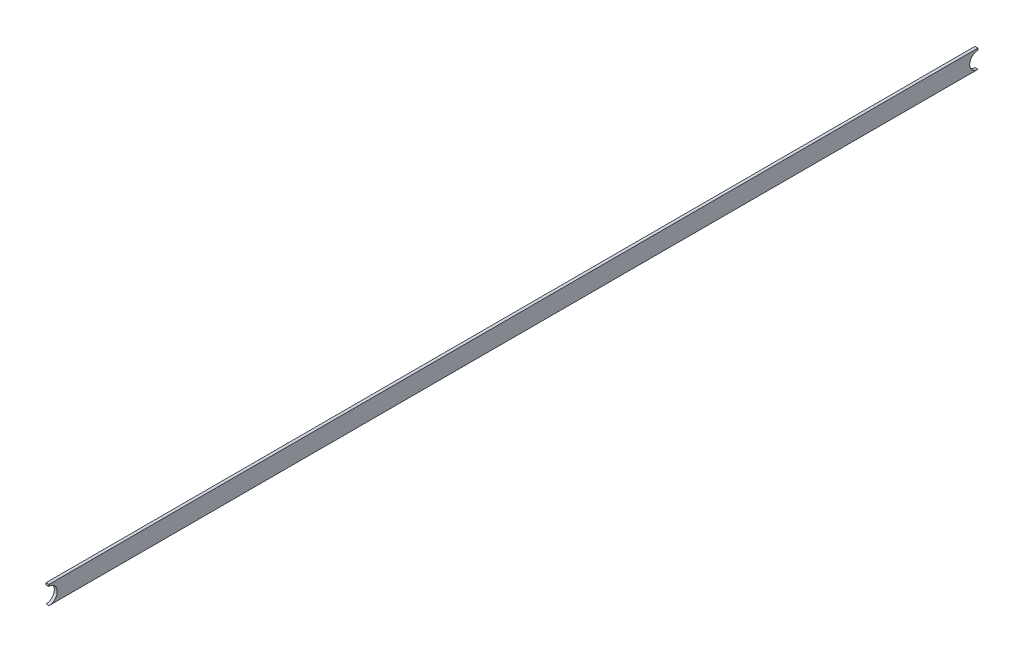
ISO-10303-21;
HEADER;
FILE_DESCRIPTION(('STEP AP214'),'2;1');
FILE_NAME('part.step','',(''),(''),'','','');
FILE_SCHEMA(('AUTOMOTIVE_DESIGN { 1 0 10303 214 1 1 1 1 }'));
ENDSEC;
DATA;
#1=APPLICATION_CONTEXT('core data for automotive mechanical design processes');
#2=APPLICATION_PROTOCOL_DEFINITION('international standard','automotive_design',2000,#1);
#3=PRODUCT_CONTEXT('',#1,'mechanical');
#4=PRODUCT('Part','Part','',(#3));
#5=PRODUCT_RELATED_PRODUCT_CATEGORY('part','',(#4));
#6=PRODUCT_DEFINITION_FORMATION('','',#4);
#7=PRODUCT_DEFINITION_CONTEXT('part definition',#1,'design');
#8=PRODUCT_DEFINITION('design','',#6,#7);
#9=PRODUCT_DEFINITION_SHAPE('','',#8);
#10=(LENGTH_UNIT() NAMED_UNIT(*) SI_UNIT(.MILLI.,.METRE.));
#11=(NAMED_UNIT(*) PLANE_ANGLE_UNIT() SI_UNIT($,.RADIAN.));
#12=(NAMED_UNIT(*) SI_UNIT($,.STERADIAN.) SOLID_ANGLE_UNIT());
#13=UNCERTAINTY_MEASURE_WITH_UNIT(LENGTH_MEASURE(1.E-05),#10,'distance_accuracy_value','');
#14=(GEOMETRIC_REPRESENTATION_CONTEXT(3) GLOBAL_UNCERTAINTY_ASSIGNED_CONTEXT((#13)) GLOBAL_UNIT_ASSIGNED_CONTEXT((#10,
#11,#12)) REPRESENTATION_CONTEXT('',''));
#15=CARTESIAN_POINT('',(0.,0.,0.));
#16=DIRECTION('',(0.,0.,1.));
#17=DIRECTION('',(1.,0.,0.));
#18=AXIS2_PLACEMENT_3D('',#15,#16,#17);
#19=CARTESIAN_POINT('',(-4.,25.,1237.5));
#20=DIRECTION('',(1.,0.,0.));
#21=DIRECTION('',(0.,0.,-1.));
#22=AXIS2_PLACEMENT_3D('',#19,#20,#21);
#23=PLANE('',#22);
#24=DIRECTION('',(0.,0.,-1.));
#25=VECTOR('',#24,1.);
#26=CARTESIAN_POINT('',(-4.,25.,1237.5));
#27=LINE('',#26,#25);
#28=CARTESIAN_POINT('',(-4.,25.,1260.));
#29=VERTEX_POINT('',#28);
#30=CARTESIAN_POINT('',(-4.,25.,-1260.));
#31=VERTEX_POINT('',#30);
#32=EDGE_CURVE('E93',#29,#31,#27,.T.);
#33=ORIENTED_EDGE('',*,*,#32,.T.);
#34=DIRECTION('',(0.,1.,0.));
#35=VECTOR('',#34,1.);
#36=CARTESIAN_POINT('',(-4.,0.,-1260.));
#37=LINE('',#36,#35);
#38=CARTESIAN_POINT('',(-4.,19.9999999999999,-1260.));
#39=VERTEX_POINT('',#38);
#40=EDGE_CURVE('E140',#39,#31,#37,.T.);
#41=ORIENTED_EDGE('',*,*,#40,.F.);
#42=CARTESIAN_POINT('',(-4.,-2.5,-1260.));
#43=DIRECTION('',(1.,0.,0.));
#44=DIRECTION('',(0.,0.,-1.));
#45=AXIS2_PLACEMENT_3D('',#42,#43,#44);
#46=CIRCLE('',#45,22.4999999999999);
#47=CARTESIAN_POINT('',(-4.,-25.,-1260.));
#48=VERTEX_POINT('',#47);
#49=EDGE_CURVE('E138',#39,#48,#46,.T.);
#50=ORIENTED_EDGE('',*,*,#49,.T.);
#51=DIRECTION('',(0.,0.,-1.));
#52=VECTOR('',#51,1.);
#53=CARTESIAN_POINT('',(-4.,-25.,1237.5));
#54=LINE('',#53,#52);
#55=CARTESIAN_POINT('',(-4.,-25.,1260.));
#56=VERTEX_POINT('',#55);
#57=EDGE_CURVE('E12',#56,#48,#54,.T.);
#58=ORIENTED_EDGE('',*,*,#57,.F.);
#59=CARTESIAN_POINT('',(-4.,-2.5,1260.));
#60=DIRECTION('',(1.,0.,0.));
#61=DIRECTION('',(0.,0.,-1.));
#62=AXIS2_PLACEMENT_3D('',#59,#60,#61);
#63=CIRCLE('',#62,22.4999999999999);
#64=CARTESIAN_POINT('',(-4.,19.9999999999999,1260.));
#65=VERTEX_POINT('',#64);
#66=EDGE_CURVE('E100',#65,#56,#63,.F.);
#67=ORIENTED_EDGE('',*,*,#66,.F.);
#68=DIRECTION('',(0.,1.,0.));
#69=VECTOR('',#68,1.);
#70=CARTESIAN_POINT('',(-4.,0.,1260.));
#71=LINE('',#70,#69);
#72=EDGE_CURVE('E162',#65,#29,#71,.T.);
#73=ORIENTED_EDGE('',*,*,#72,.T.);
#74=EDGE_LOOP('',(#33,#41,#50,#58,#67,#73));
#75=FACE_BOUND('',#74,.T.);
#76=ADVANCED_FACE('F79',(#75),#23,.F.);
#77=CARTESIAN_POINT('',(-4.,-25.,1237.5));
#78=DIRECTION('',(0.,1.,0.));
#79=DIRECTION('',(0.,0.,1.));
#80=AXIS2_PLACEMENT_3D('',#77,#78,#79);
#81=PLANE('',#80);
#82=ORIENTED_EDGE('',*,*,#57,.T.);
#83=DIRECTION('',(1.,0.,0.));
#84=VECTOR('',#83,1.);
#85=CARTESIAN_POINT('',(-39.5316760088797,-25.,-1260.));
#86=LINE('',#85,#84);
#87=CARTESIAN_POINT('',(4.,-25.,-1260.));
#88=VERTEX_POINT('',#87);
#89=EDGE_CURVE('E134',#48,#88,#86,.T.);
#90=ORIENTED_EDGE('',*,*,#89,.T.);
#91=DIRECTION('',(0.,0.,-1.));
#92=VECTOR('',#91,1.);
#93=CARTESIAN_POINT('',(4.,-25.,1237.5));
#94=LINE('',#93,#92);
#95=CARTESIAN_POINT('',(4.,-25.,1260.));
#96=VERTEX_POINT('',#95);
#97=EDGE_CURVE('E86',#96,#88,#94,.T.);
#98=ORIENTED_EDGE('',*,*,#97,.F.);
#99=DIRECTION('',(1.,0.,0.));
#100=VECTOR('',#99,1.);
#101=CARTESIAN_POINT('',(-39.5316760088797,-25.,1260.));
#102=LINE('',#101,#100);
#103=EDGE_CURVE('E136',#56,#96,#102,.T.);
#104=ORIENTED_EDGE('',*,*,#103,.F.);
#105=EDGE_LOOP('',(#82,#90,#98,#104));
#106=FACE_BOUND('',#105,.T.);
#107=ADVANCED_FACE('F132',(#106),#81,.F.);
#108=CARTESIAN_POINT('',(4.,25.,1237.5));
#109=DIRECTION('',(-1.,0.,0.));
#110=DIRECTION('',(0.,0.,1.));
#111=AXIS2_PLACEMENT_3D('',#108,#109,#110);
#112=PLANE('',#111);
#113=ORIENTED_EDGE('',*,*,#97,.T.);
#114=CARTESIAN_POINT('',(4.,-2.5,-1260.));
#115=DIRECTION('',(-1.,0.,0.));
#116=DIRECTION('',(0.,0.,1.));
#117=AXIS2_PLACEMENT_3D('',#114,#115,#116);
#118=CIRCLE('',#117,22.4999999999999);
#119=CARTESIAN_POINT('',(4.,19.9999999999999,-1260.));
#120=VERTEX_POINT('',#119);
#121=EDGE_CURVE('E147',#88,#120,#118,.T.);
#122=ORIENTED_EDGE('',*,*,#121,.T.);
#123=DIRECTION('',(0.,-1.,0.));
#124=VECTOR('',#123,1.);
#125=CARTESIAN_POINT('',(4.,0.,-1260.));
#126=LINE('',#125,#124);
#127=CARTESIAN_POINT('',(4.,25.,-1260.));
#128=VERTEX_POINT('',#127);
#129=EDGE_CURVE('E149',#128,#120,#126,.T.);
#130=ORIENTED_EDGE('',*,*,#129,.F.);
#131=DIRECTION('',(0.,0.,-1.));
#132=VECTOR('',#131,1.);
#133=CARTESIAN_POINT('',(4.,25.,1237.5));
#134=LINE('',#133,#132);
#135=CARTESIAN_POINT('',(4.,25.,1260.));
#136=VERTEX_POINT('',#135);
#137=EDGE_CURVE('E175',#136,#128,#134,.T.);
#138=ORIENTED_EDGE('',*,*,#137,.F.);
#139=DIRECTION('',(0.,-1.,0.));
#140=VECTOR('',#139,1.);
#141=CARTESIAN_POINT('',(4.,0.,1260.));
#142=LINE('',#141,#140);
#143=CARTESIAN_POINT('',(4.,19.9999999999999,1260.));
#144=VERTEX_POINT('',#143);
#145=EDGE_CURVE('E168',#136,#144,#142,.T.);
#146=ORIENTED_EDGE('',*,*,#145,.T.);
#147=CARTESIAN_POINT('',(4.,-2.5,1260.));
#148=DIRECTION('',(1.,0.,0.));
#149=DIRECTION('',(0.,0.,-1.));
#150=AXIS2_PLACEMENT_3D('',#147,#148,#149);
#151=CIRCLE('',#150,22.4999999999999);
#152=EDGE_CURVE('E161',#96,#144,#151,.T.);
#153=ORIENTED_EDGE('',*,*,#152,.F.);
#154=EDGE_LOOP('',(#113,#122,#130,#138,#146,#153));
#155=FACE_BOUND('',#154,.T.);
#156=ADVANCED_FACE('F178',(#155),#112,.F.);
#157=CARTESIAN_POINT('',(-4.,25.,1237.5));
#158=DIRECTION('',(0.,-1.,0.));
#159=DIRECTION('',(0.,0.,-1.));
#160=AXIS2_PLACEMENT_3D('',#157,#158,#159);
#161=PLANE('',#160);
#162=ORIENTED_EDGE('',*,*,#137,.T.);
#163=DIRECTION('',(1.,0.,0.));
#164=VECTOR('',#163,1.);
#165=CARTESIAN_POINT('',(-39.5316760088797,25.,-1260.));
#166=LINE('',#165,#164);
#167=EDGE_CURVE('E155',#31,#128,#166,.T.);
#168=ORIENTED_EDGE('',*,*,#167,.F.);
#169=ORIENTED_EDGE('',*,*,#32,.F.);
#170=DIRECTION('',(1.,0.,0.));
#171=VECTOR('',#170,1.);
#172=CARTESIAN_POINT('',(-39.5316760088797,25.,1260.));
#173=LINE('',#172,#171);
#174=EDGE_CURVE('E171',#29,#136,#173,.T.);
#175=ORIENTED_EDGE('',*,*,#174,.T.);
#176=EDGE_LOOP('',(#162,#168,#169,#175));
#177=FACE_BOUND('',#176,.T.);
#178=ADVANCED_FACE('F187',(#177),#161,.F.);
#179=CARTESIAN_POINT('',(-39.5316760088797,0.,1260.));
#180=DIRECTION('',(0.,0.,1.));
#181=DIRECTION('',(1.,0.,0.));
#182=AXIS2_PLACEMENT_3D('',#179,#180,#181);
#183=PLANE('',#182);
#184=ORIENTED_EDGE('',*,*,#72,.F.);
#185=DIRECTION('',(1.,0.,0.));
#186=VECTOR('',#185,1.);
#187=CARTESIAN_POINT('',(-39.5316760088797,19.9999999999999,1260.));
#188=LINE('',#187,#186);
#189=EDGE_CURVE('E164',#65,#144,#188,.T.);
#190=ORIENTED_EDGE('',*,*,#189,.T.);
#191=ORIENTED_EDGE('',*,*,#145,.F.);
#192=ORIENTED_EDGE('',*,*,#174,.F.);
#193=EDGE_LOOP('',(#184,#190,#191,#192));
#194=FACE_BOUND('',#193,.T.);
#195=ADVANCED_FACE('F186',(#194),#183,.T.);
#196=CARTESIAN_POINT('',(-39.5316760088797,-2.5,1260.));
#197=DIRECTION('',(1.,0.,0.));
#198=DIRECTION('',(0.,0.,-1.));
#199=AXIS2_PLACEMENT_3D('',#196,#197,#198);
#200=CYLINDRICAL_SURFACE('',#199,22.4999999999999);
#201=ORIENTED_EDGE('',*,*,#189,.F.);
#202=ORIENTED_EDGE('',*,*,#66,.T.);
#203=ORIENTED_EDGE('',*,*,#103,.T.);
#204=ORIENTED_EDGE('',*,*,#152,.T.);
#205=EDGE_LOOP('',(#201,#202,#203,#204));
#206=FACE_BOUND('',#205,.T.);
#207=ADVANCED_FACE('F182',(#206),#200,.F.);
#208=CARTESIAN_POINT('',(-39.5316760088797,0.,-1260.));
#209=DIRECTION('',(0.,0.,1.));
#210=DIRECTION('',(1.,0.,0.));
#211=AXIS2_PLACEMENT_3D('',#208,#209,#210);
#212=PLANE('',#211);
#213=DIRECTION('',(1.,0.,0.));
#214=VECTOR('',#213,1.);
#215=CARTESIAN_POINT('',(-39.5316760088797,19.9999999999999,-1260.));
#216=LINE('',#215,#214);
#217=EDGE_CURVE('E154',#39,#120,#216,.T.);
#218=ORIENTED_EDGE('',*,*,#217,.F.);
#219=ORIENTED_EDGE('',*,*,#40,.T.);
#220=ORIENTED_EDGE('',*,*,#167,.T.);
#221=ORIENTED_EDGE('',*,*,#129,.T.);
#222=EDGE_LOOP('',(#218,#219,#220,#221));
#223=FACE_BOUND('',#222,.T.);
#224=ADVANCED_FACE('F189',(#223),#212,.F.);
#225=CARTESIAN_POINT('',(-39.5316760088797,-2.5,-1260.));
#226=DIRECTION('',(1.,0.,0.));
#227=DIRECTION('',(0.,0.,-1.));
#228=AXIS2_PLACEMENT_3D('',#225,#226,#227);
#229=CYLINDRICAL_SURFACE('',#228,22.4999999999999);
#230=ORIENTED_EDGE('',*,*,#49,.F.);
#231=ORIENTED_EDGE('',*,*,#217,.T.);
#232=ORIENTED_EDGE('',*,*,#121,.F.);
#233=ORIENTED_EDGE('',*,*,#89,.F.);
#234=EDGE_LOOP('',(#230,#231,#232,#233));
#235=FACE_BOUND('',#234,.T.);
#236=ADVANCED_FACE('F145',(#235),#229,.F.);
#237=CLOSED_SHELL('',(#76,#107,#156,#178,#195,#207,#224,#236));
#238=MANIFOLD_SOLID_BREP('B2',#237);
#239=ADVANCED_BREP_SHAPE_REPRESENTATION('',(#18,#238),#14);
#240=SHAPE_DEFINITION_REPRESENTATION(#9,#239);
ENDSEC;
END-ISO-10303-21;
